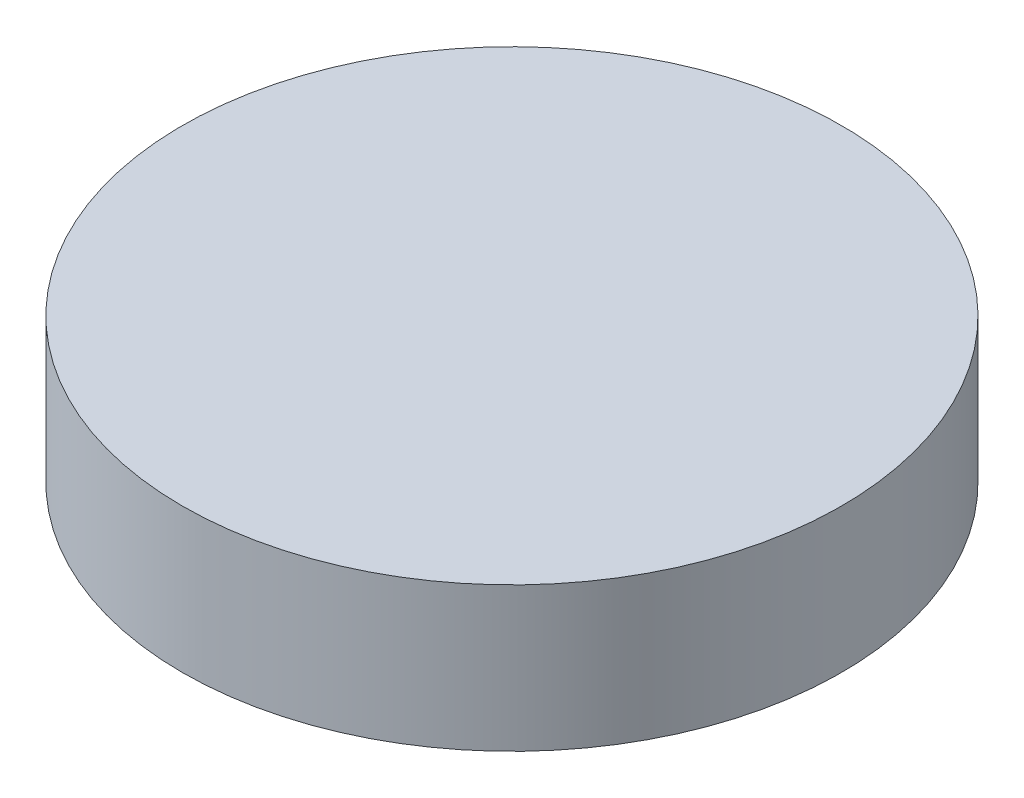
ISO-10303-21;
HEADER;
FILE_DESCRIPTION(('STEP AP214'),'2;1');
FILE_NAME('part.step','',(''),(''),'','','');
FILE_SCHEMA(('AUTOMOTIVE_DESIGN { 1 0 10303 214 1 1 1 1 }'));
ENDSEC;
DATA;
#1=APPLICATION_CONTEXT('core data for automotive mechanical design processes');
#2=APPLICATION_PROTOCOL_DEFINITION('international standard','automotive_design',2000,#1);
#3=PRODUCT_CONTEXT('',#1,'mechanical');
#4=PRODUCT('Part','Part','',(#3));
#5=PRODUCT_RELATED_PRODUCT_CATEGORY('part','',(#4));
#6=PRODUCT_DEFINITION_FORMATION('','',#4);
#7=PRODUCT_DEFINITION_CONTEXT('part definition',#1,'design');
#8=PRODUCT_DEFINITION('design','',#6,#7);
#9=PRODUCT_DEFINITION_SHAPE('','',#8);
#10=(LENGTH_UNIT() NAMED_UNIT(*) SI_UNIT(.MILLI.,.METRE.));
#11=(NAMED_UNIT(*) PLANE_ANGLE_UNIT() SI_UNIT($,.RADIAN.));
#12=(NAMED_UNIT(*) SI_UNIT($,.STERADIAN.) SOLID_ANGLE_UNIT());
#13=UNCERTAINTY_MEASURE_WITH_UNIT(LENGTH_MEASURE(1.E-05),#10,'distance_accuracy_value','');
#14=(GEOMETRIC_REPRESENTATION_CONTEXT(3) GLOBAL_UNCERTAINTY_ASSIGNED_CONTEXT((#13)) GLOBAL_UNIT_ASSIGNED_CONTEXT((#10,
#11,#12)) REPRESENTATION_CONTEXT('',''));
#15=CARTESIAN_POINT('',(0.,0.,0.));
#16=DIRECTION('',(0.,0.,1.));
#17=DIRECTION('',(1.,0.,0.));
#18=AXIS2_PLACEMENT_3D('',#15,#16,#17);
#19=CARTESIAN_POINT('',(0.,22.225,0.));
#20=DIRECTION('',(0.,-1.,0.));
#21=DIRECTION('',(0.,0.,-1.));
#22=AXIS2_PLACEMENT_3D('',#19,#20,#21);
#23=CYLINDRICAL_SURFACE('',#22,50.8);
#24=CARTESIAN_POINT('',(0.,22.225,0.));
#25=DIRECTION('',(0.,1.,0.));
#26=DIRECTION('',(0.,0.,1.));
#27=AXIS2_PLACEMENT_3D('',#24,#25,#26);
#28=CIRCLE('',#27,50.8);
#29=CARTESIAN_POINT('',(0.,22.225,50.8));
#30=VERTEX_POINT('',#29);
#31=EDGE_CURVE('E10',#30,#30,#28,.T.);
#32=ORIENTED_EDGE('',*,*,#31,.F.);
#33=EDGE_LOOP('',(#32));
#34=FACE_BOUND('',#33,.T.);
#35=CARTESIAN_POINT('',(0.,0.,0.));
#36=DIRECTION('',(0.,1.,0.));
#37=DIRECTION('',(0.,0.,1.));
#38=AXIS2_PLACEMENT_3D('',#35,#36,#37);
#39=CIRCLE('',#38,50.8);
#40=CARTESIAN_POINT('',(0.,0.,50.8));
#41=VERTEX_POINT('',#40);
#42=EDGE_CURVE('E34',#41,#41,#39,.T.);
#43=ORIENTED_EDGE('',*,*,#42,.T.);
#44=EDGE_LOOP('',(#43));
#45=FACE_BOUND('',#44,.T.);
#46=ADVANCED_FACE('F31',(#34,#45),#23,.T.);
#47=CARTESIAN_POINT('',(0.,22.225,0.));
#48=DIRECTION('',(0.,1.,0.));
#49=DIRECTION('',(0.,0.,1.));
#50=AXIS2_PLACEMENT_3D('',#47,#48,#49);
#51=PLANE('',#50);
#52=ORIENTED_EDGE('',*,*,#31,.T.);
#53=EDGE_LOOP('',(#52));
#54=FACE_BOUND('',#53,.T.);
#55=ADVANCED_FACE('F46',(#54),#51,.T.);
#56=CARTESIAN_POINT('',(0.,0.,0.));
#57=DIRECTION('',(0.,1.,0.));
#58=DIRECTION('',(0.,0.,1.));
#59=AXIS2_PLACEMENT_3D('',#56,#57,#58);
#60=PLANE('',#59);
#61=ORIENTED_EDGE('',*,*,#42,.F.);
#62=EDGE_LOOP('',(#61));
#63=FACE_BOUND('',#62,.T.);
#64=ADVANCED_FACE('F44',(#63),#60,.F.);
#65=CLOSED_SHELL('',(#46,#55,#64));
#66=MANIFOLD_SOLID_BREP('B2',#65);
#67=ADVANCED_BREP_SHAPE_REPRESENTATION('',(#18,#66),#14);
#68=SHAPE_DEFINITION_REPRESENTATION(#9,#67);
ENDSEC;
END-ISO-10303-21;
